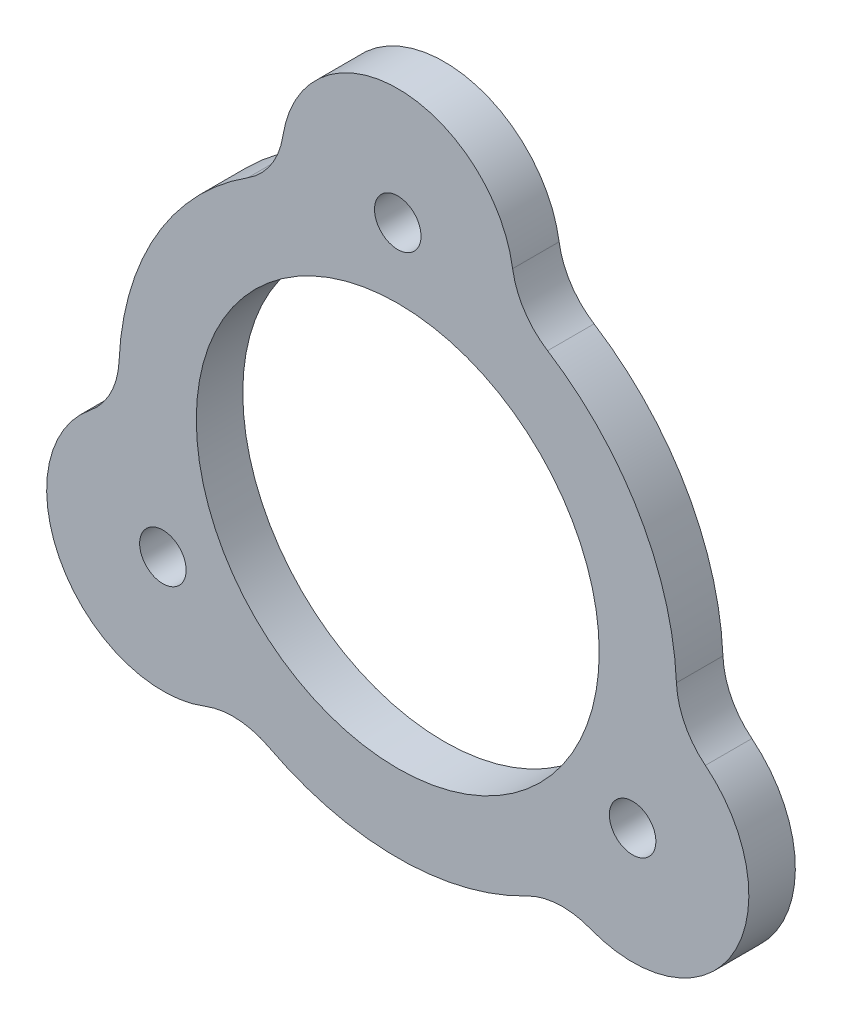
ISO-10303-21;
HEADER;
FILE_DESCRIPTION(('STEP AP214'),'2;1');
FILE_NAME('part.step','',(''),(''),'','','');
FILE_SCHEMA(('AUTOMOTIVE_DESIGN { 1 0 10303 214 1 1 1 1 }'));
ENDSEC;
DATA;
#1=APPLICATION_CONTEXT('core data for automotive mechanical design processes');
#2=APPLICATION_PROTOCOL_DEFINITION('international standard','automotive_design',2000,#1);
#3=PRODUCT_CONTEXT('',#1,'mechanical');
#4=PRODUCT('Part','Part','',(#3));
#5=PRODUCT_RELATED_PRODUCT_CATEGORY('part','',(#4));
#6=PRODUCT_DEFINITION_FORMATION('','',#4);
#7=PRODUCT_DEFINITION_CONTEXT('part definition',#1,'design');
#8=PRODUCT_DEFINITION('design','',#6,#7);
#9=PRODUCT_DEFINITION_SHAPE('','',#8);
#10=(LENGTH_UNIT() NAMED_UNIT(*) SI_UNIT(.MILLI.,.METRE.));
#11=(NAMED_UNIT(*) PLANE_ANGLE_UNIT() SI_UNIT($,.RADIAN.));
#12=(NAMED_UNIT(*) SI_UNIT($,.STERADIAN.) SOLID_ANGLE_UNIT());
#13=UNCERTAINTY_MEASURE_WITH_UNIT(LENGTH_MEASURE(1.E-05),#10,'distance_accuracy_value','');
#14=(GEOMETRIC_REPRESENTATION_CONTEXT(3) GLOBAL_UNCERTAINTY_ASSIGNED_CONTEXT((#13)) GLOBAL_UNIT_ASSIGNED_CONTEXT((#10,
#11,#12)) REPRESENTATION_CONTEXT('',''));
#15=CARTESIAN_POINT('',(0.,0.,0.));
#16=DIRECTION('',(0.,0.,1.));
#17=DIRECTION('',(1.,0.,0.));
#18=AXIS2_PLACEMENT_3D('',#15,#16,#17);
#19=CARTESIAN_POINT('',(0.,17.5,3.));
#20=DIRECTION('',(0.,0.,-1.));
#21=DIRECTION('',(-1.,0.,0.));
#22=AXIS2_PLACEMENT_3D('',#19,#20,#21);
#23=CYLINDRICAL_SURFACE('',#22,7.5);
#24=CARTESIAN_POINT('',(0.,17.5,3.));
#25=DIRECTION('',(0.,0.,1.));
#26=DIRECTION('',(1.,0.,0.));
#27=AXIS2_PLACEMENT_3D('',#24,#25,#26);
#28=CIRCLE('',#27,7.5);
#29=CARTESIAN_POINT('',(7.41285370151064,18.64,3.));
#30=VERTEX_POINT('',#29);
#31=CARTESIAN_POINT('',(-7.41285370151064,18.64,3.));
#32=VERTEX_POINT('',#31);
#33=EDGE_CURVE('E206',#30,#32,#28,.T.);
#34=ORIENTED_EDGE('',*,*,#33,.F.);
#35=DIRECTION('',(0.,0.,-1.));
#36=VECTOR('',#35,1.);
#37=CARTESIAN_POINT('',(7.41285370151064,18.64,3.));
#38=LINE('',#37,#36);
#39=CARTESIAN_POINT('',(7.41285370151064,18.64,0.));
#40=VERTEX_POINT('',#39);
#41=EDGE_CURVE('E169',#30,#40,#38,.T.);
#42=ORIENTED_EDGE('',*,*,#41,.T.);
#43=CARTESIAN_POINT('',(0.,17.5,0.));
#44=DIRECTION('',(0.,0.,1.));
#45=DIRECTION('',(1.,0.,0.));
#46=AXIS2_PLACEMENT_3D('',#43,#44,#45);
#47=CIRCLE('',#46,7.5);
#48=CARTESIAN_POINT('',(-7.41285370151064,18.64,0.));
#49=VERTEX_POINT('',#48);
#50=EDGE_CURVE('E130',#40,#49,#47,.T.);
#51=ORIENTED_EDGE('',*,*,#50,.T.);
#52=DIRECTION('',(0.,0.,-1.));
#53=VECTOR('',#52,1.);
#54=CARTESIAN_POINT('',(-7.41285370151064,18.64,3.));
#55=LINE('',#54,#53);
#56=EDGE_CURVE('E166',#49,#32,#55,.F.);
#57=ORIENTED_EDGE('',*,*,#56,.T.);
#58=EDGE_LOOP('',(#34,#42,#51,#57));
#59=FACE_BOUND('',#58,.T.);
#60=ADVANCED_FACE('F36',(#59),#23,.T.);
#61=CARTESIAN_POINT('',(-15.1554445662276,-8.75000000000007,3.));
#62=DIRECTION('',(0.,0.,-1.));
#63=DIRECTION('',(-1.,0.,0.));
#64=AXIS2_PLACEMENT_3D('',#61,#62,#63);
#65=CYLINDRICAL_SURFACE('',#64,7.5);
#66=CARTESIAN_POINT('',(-15.1554445662276,-8.75000000000007,3.));
#67=DIRECTION('',(0.,0.,1.));
#68=DIRECTION('',(1.,0.,0.));
#69=AXIS2_PLACEMENT_3D('',#66,#67,#68);
#70=CIRCLE('',#69,7.5);
#71=CARTESIAN_POINT('',(-19.8491403772972,-2.90028037995438,3.));
#72=VERTEX_POINT('',#71);
#73=CARTESIAN_POINT('',(-12.4362866757865,-15.7397196200458,3.));
#74=VERTEX_POINT('',#73);
#75=EDGE_CURVE('E156',#72,#74,#70,.T.);
#76=ORIENTED_EDGE('',*,*,#75,.F.);
#77=DIRECTION('',(0.,0.,-1.));
#78=VECTOR('',#77,1.);
#79=CARTESIAN_POINT('',(-19.8491403772972,-2.90028037995438,3.));
#80=LINE('',#79,#78);
#81=CARTESIAN_POINT('',(-19.8491403772972,-2.90028037995438,0.));
#82=VERTEX_POINT('',#81);
#83=EDGE_CURVE('E174',#72,#82,#80,.T.);
#84=ORIENTED_EDGE('',*,*,#83,.T.);
#85=CARTESIAN_POINT('',(-15.1554445662276,-8.75000000000007,0.));
#86=DIRECTION('',(0.,0.,1.));
#87=DIRECTION('',(1.,0.,0.));
#88=AXIS2_PLACEMENT_3D('',#85,#86,#87);
#89=CIRCLE('',#88,7.5);
#90=CARTESIAN_POINT('',(-12.4362866757865,-15.7397196200458,0.));
#91=VERTEX_POINT('',#90);
#92=EDGE_CURVE('E220',#82,#91,#89,.T.);
#93=ORIENTED_EDGE('',*,*,#92,.T.);
#94=DIRECTION('',(0.,0.,-1.));
#95=VECTOR('',#94,1.);
#96=CARTESIAN_POINT('',(-12.4362866757865,-15.7397196200458,3.));
#97=LINE('',#96,#95);
#98=EDGE_CURVE('E171',#91,#74,#97,.F.);
#99=ORIENTED_EDGE('',*,*,#98,.T.);
#100=EDGE_LOOP('',(#76,#84,#93,#99));
#101=FACE_BOUND('',#100,.T.);
#102=ADVANCED_FACE('F272',(#101),#65,.T.);
#103=CARTESIAN_POINT('',(15.1554445662276,-8.75000000000007,3.));
#104=DIRECTION('',(0.,0.,-1.));
#105=DIRECTION('',(-1.,0.,0.));
#106=AXIS2_PLACEMENT_3D('',#103,#104,#105);
#107=CYLINDRICAL_SURFACE('',#106,7.5);
#108=CARTESIAN_POINT('',(15.1554445662276,-8.75000000000007,0.));
#109=DIRECTION('',(0.,0.,1.));
#110=DIRECTION('',(1.,0.,0.));
#111=AXIS2_PLACEMENT_3D('',#108,#109,#110);
#112=CIRCLE('',#111,7.5);
#113=CARTESIAN_POINT('',(12.4362866757865,-15.7397196200458,0.));
#114=VERTEX_POINT('',#113);
#115=CARTESIAN_POINT('',(19.8491403772972,-2.90028037995437,0.));
#116=VERTEX_POINT('',#115);
#117=EDGE_CURVE('E159',#114,#116,#112,.T.);
#118=ORIENTED_EDGE('',*,*,#117,.T.);
#119=DIRECTION('',(0.,0.,-1.));
#120=VECTOR('',#119,1.);
#121=CARTESIAN_POINT('',(19.8491403772972,-2.90028037995437,3.));
#122=LINE('',#121,#120);
#123=CARTESIAN_POINT('',(19.8491403772972,-2.90028037995437,3.));
#124=VERTEX_POINT('',#123);
#125=EDGE_CURVE('E164',#116,#124,#122,.F.);
#126=ORIENTED_EDGE('',*,*,#125,.T.);
#127=CARTESIAN_POINT('',(15.1554445662276,-8.75000000000007,3.));
#128=DIRECTION('',(0.,0.,1.));
#129=DIRECTION('',(1.,0.,0.));
#130=AXIS2_PLACEMENT_3D('',#127,#128,#129);
#131=CIRCLE('',#130,7.5);
#132=CARTESIAN_POINT('',(12.4362866757865,-15.7397196200458,3.));
#133=VERTEX_POINT('',#132);
#134=EDGE_CURVE('E151',#133,#124,#131,.T.);
#135=ORIENTED_EDGE('',*,*,#134,.F.);
#136=DIRECTION('',(0.,0.,-1.));
#137=VECTOR('',#136,1.);
#138=CARTESIAN_POINT('',(12.4362866757865,-15.7397196200458,3.));
#139=LINE('',#138,#137);
#140=EDGE_CURVE('E153',#133,#114,#139,.T.);
#141=ORIENTED_EDGE('',*,*,#140,.T.);
#142=EDGE_LOOP('',(#118,#126,#135,#141));
#143=FACE_BOUND('',#142,.T.);
#144=ADVANCED_FACE('F258',(#143),#107,.T.);
#145=CARTESIAN_POINT('',(0.,0.,3.));
#146=DIRECTION('',(0.,0.,1.));
#147=DIRECTION('',(1.,0.,0.));
#148=AXIS2_PLACEMENT_3D('',#145,#146,#147);
#149=PLANE('',#148);
#150=CARTESIAN_POINT('',(15.1554445662275,-8.75000000000029,3.));
#151=DIRECTION('',(0.,0.,1.));
#152=DIRECTION('',(-0.500000000000016,-0.866025403784429,0.));
#153=AXIS2_PLACEMENT_3D('',#150,#151,#152);
#154=CIRCLE('',#153,1.5);
#155=CARTESIAN_POINT('',(14.4054445662275,-10.0490381056769,3.));
#156=VERTEX_POINT('',#155);
#157=EDGE_CURVE('E233',#156,#156,#154,.T.);
#158=ORIENTED_EDGE('',*,*,#157,.F.);
#159=EDGE_LOOP('',(#158));
#160=FACE_BOUND('',#159,.T.);
#161=CARTESIAN_POINT('',(-15.155444566228,-8.74999999999943,3.));
#162=DIRECTION('',(0.,0.,1.));
#163=DIRECTION('',(-0.499999999999967,0.866025403784457,0.));
#164=AXIS2_PLACEMENT_3D('',#161,#162,#163);
#165=CIRCLE('',#164,1.5);
#166=CARTESIAN_POINT('',(-15.905444566228,-7.45096189432274,3.));
#167=VERTEX_POINT('',#166);
#168=EDGE_CURVE('E239',#167,#167,#165,.T.);
#169=ORIENTED_EDGE('',*,*,#168,.F.);
#170=EDGE_LOOP('',(#169));
#171=FACE_BOUND('',#170,.T.);
#172=CARTESIAN_POINT('',(0.,17.5,3.));
#173=DIRECTION('',(0.,0.,1.));
#174=DIRECTION('',(1.,0.,0.));
#175=AXIS2_PLACEMENT_3D('',#172,#173,#174);
#176=CIRCLE('',#175,1.5);
#177=CARTESIAN_POINT('',(1.5,17.5,3.));
#178=VERTEX_POINT('',#177);
#179=EDGE_CURVE('E225',#178,#178,#176,.T.);
#180=ORIENTED_EDGE('',*,*,#179,.F.);
#181=EDGE_LOOP('',(#180));
#182=FACE_BOUND('',#181,.T.);
#183=CARTESIAN_POINT('',(0.,0.,3.));
#184=DIRECTION('',(0.,0.,1.));
#185=DIRECTION('',(1.,0.,0.));
#186=AXIS2_PLACEMENT_3D('',#183,#184,#185);
#187=CIRCLE('',#186,13.);
#188=CARTESIAN_POINT('',(13.,0.,3.));
#189=VERTEX_POINT('',#188);
#190=EDGE_CURVE('E245',#189,#189,#187,.T.);
#191=ORIENTED_EDGE('',*,*,#190,.F.);
#192=EDGE_LOOP('',(#191));
#193=FACE_BOUND('',#192,.T.);
#194=ORIENTED_EDGE('',*,*,#75,.T.);
#195=CARTESIAN_POINT('',(-10.6235147488258,-20.3995327000763,3.));
#196=DIRECTION('',(0.,0.,1.));
#197=DIRECTION('',(1.,0.,0.));
#198=AXIS2_PLACEMENT_3D('',#195,#196,#197);
#199=CIRCLE('',#198,5.);
#200=CARTESIAN_POINT('',(-8.3140550208202,-15.9648516783205,3.));
#201=VERTEX_POINT('',#200);
#202=EDGE_CURVE('E192',#74,#201,#199,.F.);
#203=ORIENTED_EDGE('',*,*,#202,.T.);
#204=CARTESIAN_POINT('',(0.,0.,3.));
#205=DIRECTION('',(0.,0.,1.));
#206=DIRECTION('',(1.,0.,0.));
#207=AXIS2_PLACEMENT_3D('',#204,#205,#206);
#208=CIRCLE('',#207,18.);
#209=CARTESIAN_POINT('',(8.3140550208202,-15.9648516783205,3.));
#210=VERTEX_POINT('',#209);
#211=EDGE_CURVE('E215',#201,#210,#208,.T.);
#212=ORIENTED_EDGE('',*,*,#211,.T.);
#213=CARTESIAN_POINT('',(10.6235147488258,-20.3995327000763,3.));
#214=DIRECTION('',(0.,0.,1.));
#215=DIRECTION('',(1.,0.,0.));
#216=AXIS2_PLACEMENT_3D('',#213,#214,#215);
#217=CIRCLE('',#216,5.);
#218=EDGE_CURVE('E197',#210,#133,#217,.F.);
#219=ORIENTED_EDGE('',*,*,#218,.T.);
#220=ORIENTED_EDGE('',*,*,#134,.T.);
#221=CARTESIAN_POINT('',(22.9782709180103,0.999532700076094,3.));
#222=DIRECTION('',(0.,0.,1.));
#223=DIRECTION('',(1.,0.,0.));
#224=AXIS2_PLACEMENT_3D('',#221,#222,#223);
#225=CIRCLE('',#224,5.);
#226=CARTESIAN_POINT('',(17.9829946314863,0.782242982668247,3.));
#227=VERTEX_POINT('',#226);
#228=EDGE_CURVE('E186',#124,#227,#225,.F.);
#229=ORIENTED_EDGE('',*,*,#228,.T.);
#230=CARTESIAN_POINT('',(9.66893961066605,15.1826086956522,3.));
#231=VERTEX_POINT('',#230);
#232=EDGE_CURVE('E217',#227,#231,#208,.T.);
#233=ORIENTED_EDGE('',*,*,#232,.T.);
#234=CARTESIAN_POINT('',(12.3547561691844,19.4,3.));
#235=DIRECTION('',(0.,0.,1.));
#236=DIRECTION('',(1.,0.,0.));
#237=AXIS2_PLACEMENT_3D('',#234,#235,#236);
#238=CIRCLE('',#237,5.);
#239=EDGE_CURVE('E135',#231,#30,#238,.F.);
#240=ORIENTED_EDGE('',*,*,#239,.T.);
#241=ORIENTED_EDGE('',*,*,#33,.T.);
#242=CARTESIAN_POINT('',(-12.3547561691844,19.4,3.));
#243=DIRECTION('',(0.,0.,1.));
#244=DIRECTION('',(1.,0.,0.));
#245=AXIS2_PLACEMENT_3D('',#242,#243,#244);
#246=CIRCLE('',#245,5.);
#247=CARTESIAN_POINT('',(-9.66893961066605,15.1826086956522,3.));
#248=VERTEX_POINT('',#247);
#249=EDGE_CURVE('E44',#32,#248,#246,.F.);
#250=ORIENTED_EDGE('',*,*,#249,.T.);
#251=CARTESIAN_POINT('',(-17.9829946314863,0.782242982668247,3.));
#252=VERTEX_POINT('',#251);
#253=EDGE_CURVE('E147',#248,#252,#208,.T.);
#254=ORIENTED_EDGE('',*,*,#253,.T.);
#255=CARTESIAN_POINT('',(-22.9782709180103,0.999532700076094,3.));
#256=DIRECTION('',(0.,0.,1.));
#257=DIRECTION('',(1.,0.,0.));
#258=AXIS2_PLACEMENT_3D('',#255,#256,#257);
#259=CIRCLE('',#258,5.);
#260=EDGE_CURVE('E190',#252,#72,#259,.F.);
#261=ORIENTED_EDGE('',*,*,#260,.T.);
#262=EDGE_LOOP('',(#194,#203,#212,#219,#220,#229,#233,#240,#241,#250,#254,#261));
#263=FACE_BOUND('',#262,.T.);
#264=ADVANCED_FACE('F203',(#160,#171,#182,#193,#263),#149,.T.);
#265=CARTESIAN_POINT('',(0.,0.,0.));
#266=DIRECTION('',(0.,0.,1.));
#267=DIRECTION('',(1.,0.,0.));
#268=AXIS2_PLACEMENT_3D('',#265,#266,#267);
#269=PLANE('',#268);
#270=CARTESIAN_POINT('',(0.,0.,0.));
#271=DIRECTION('',(0.,0.,1.));
#272=DIRECTION('',(1.,0.,0.));
#273=AXIS2_PLACEMENT_3D('',#270,#271,#272);
#274=CIRCLE('',#273,13.);
#275=CARTESIAN_POINT('',(13.,0.,0.));
#276=VERTEX_POINT('',#275);
#277=EDGE_CURVE('E248',#276,#276,#274,.T.);
#278=ORIENTED_EDGE('',*,*,#277,.T.);
#279=EDGE_LOOP('',(#278));
#280=FACE_BOUND('',#279,.T.);
#281=CARTESIAN_POINT('',(0.,17.5,0.));
#282=DIRECTION('',(0.,0.,1.));
#283=DIRECTION('',(1.,0.,0.));
#284=AXIS2_PLACEMENT_3D('',#281,#282,#283);
#285=CIRCLE('',#284,1.5);
#286=CARTESIAN_POINT('',(1.5,17.5,0.));
#287=VERTEX_POINT('',#286);
#288=EDGE_CURVE('E221',#287,#287,#285,.T.);
#289=ORIENTED_EDGE('',*,*,#288,.T.);
#290=EDGE_LOOP('',(#289));
#291=FACE_BOUND('',#290,.T.);
#292=CARTESIAN_POINT('',(-15.155444566228,-8.74999999999943,0.));
#293=DIRECTION('',(0.,0.,1.));
#294=DIRECTION('',(-0.499999999999967,0.866025403784457,0.));
#295=AXIS2_PLACEMENT_3D('',#292,#293,#294);
#296=CIRCLE('',#295,1.5);
#297=CARTESIAN_POINT('',(-15.905444566228,-7.45096189432274,0.));
#298=VERTEX_POINT('',#297);
#299=EDGE_CURVE('E236',#298,#298,#296,.T.);
#300=ORIENTED_EDGE('',*,*,#299,.T.);
#301=EDGE_LOOP('',(#300));
#302=FACE_BOUND('',#301,.T.);
#303=CARTESIAN_POINT('',(15.1554445662275,-8.75000000000029,0.));
#304=DIRECTION('',(0.,0.,1.));
#305=DIRECTION('',(-0.500000000000016,-0.866025403784429,0.));
#306=AXIS2_PLACEMENT_3D('',#303,#304,#305);
#307=CIRCLE('',#306,1.5);
#308=CARTESIAN_POINT('',(14.4054445662275,-10.0490381056769,0.));
#309=VERTEX_POINT('',#308);
#310=EDGE_CURVE('E231',#309,#309,#307,.T.);
#311=ORIENTED_EDGE('',*,*,#310,.T.);
#312=EDGE_LOOP('',(#311));
#313=FACE_BOUND('',#312,.T.);
#314=ORIENTED_EDGE('',*,*,#117,.F.);
#315=CARTESIAN_POINT('',(10.6235147488258,-20.3995327000763,0.));
#316=DIRECTION('',(0.,0.,1.));
#317=DIRECTION('',(1.,0.,0.));
#318=AXIS2_PLACEMENT_3D('',#315,#316,#317);
#319=CIRCLE('',#318,5.);
#320=CARTESIAN_POINT('',(8.3140550208202,-15.9648516783205,0.));
#321=VERTEX_POINT('',#320);
#322=EDGE_CURVE('E58',#114,#321,#319,.T.);
#323=ORIENTED_EDGE('',*,*,#322,.T.);
#324=CARTESIAN_POINT('',(0.,0.,0.));
#325=DIRECTION('',(0.,0.,1.));
#326=DIRECTION('',(1.,0.,0.));
#327=AXIS2_PLACEMENT_3D('',#324,#325,#326);
#328=CIRCLE('',#327,18.);
#329=CARTESIAN_POINT('',(-8.3140550208202,-15.9648516783205,0.));
#330=VERTEX_POINT('',#329);
#331=EDGE_CURVE('E149',#321,#330,#328,.F.);
#332=ORIENTED_EDGE('',*,*,#331,.T.);
#333=CARTESIAN_POINT('',(-10.6235147488258,-20.3995327000763,0.));
#334=DIRECTION('',(0.,0.,1.));
#335=DIRECTION('',(1.,0.,0.));
#336=AXIS2_PLACEMENT_3D('',#333,#334,#335);
#337=CIRCLE('',#336,5.);
#338=EDGE_CURVE('E194',#330,#91,#337,.T.);
#339=ORIENTED_EDGE('',*,*,#338,.T.);
#340=ORIENTED_EDGE('',*,*,#92,.F.);
#341=CARTESIAN_POINT('',(-22.9782709180103,0.999532700076094,0.));
#342=DIRECTION('',(0.,0.,1.));
#343=DIRECTION('',(1.,0.,0.));
#344=AXIS2_PLACEMENT_3D('',#341,#342,#343);
#345=CIRCLE('',#344,5.);
#346=CARTESIAN_POINT('',(-17.9829946314863,0.782242982668247,0.));
#347=VERTEX_POINT('',#346);
#348=EDGE_CURVE('E134',#82,#347,#345,.T.);
#349=ORIENTED_EDGE('',*,*,#348,.T.);
#350=CARTESIAN_POINT('',(-9.66893961066605,15.1826086956522,0.));
#351=VERTEX_POINT('',#350);
#352=EDGE_CURVE('E146',#347,#351,#328,.F.);
#353=ORIENTED_EDGE('',*,*,#352,.T.);
#354=CARTESIAN_POINT('',(-12.3547561691844,19.4,0.));
#355=DIRECTION('',(0.,0.,1.));
#356=DIRECTION('',(1.,0.,0.));
#357=AXIS2_PLACEMENT_3D('',#354,#355,#356);
#358=CIRCLE('',#357,5.);
#359=EDGE_CURVE('E11',#351,#49,#358,.T.);
#360=ORIENTED_EDGE('',*,*,#359,.T.);
#361=ORIENTED_EDGE('',*,*,#50,.F.);
#362=CARTESIAN_POINT('',(12.3547561691844,19.4,0.));
#363=DIRECTION('',(0.,0.,1.));
#364=DIRECTION('',(1.,0.,0.));
#365=AXIS2_PLACEMENT_3D('',#362,#363,#364);
#366=CIRCLE('',#365,5.);
#367=CARTESIAN_POINT('',(9.66893961066605,15.1826086956522,0.));
#368=VERTEX_POINT('',#367);
#369=EDGE_CURVE('E125',#40,#368,#366,.T.);
#370=ORIENTED_EDGE('',*,*,#369,.T.);
#371=CARTESIAN_POINT('',(17.9829946314863,0.782242982668247,0.));
#372=VERTEX_POINT('',#371);
#373=EDGE_CURVE('E128',#368,#372,#328,.F.);
#374=ORIENTED_EDGE('',*,*,#373,.T.);
#375=CARTESIAN_POINT('',(22.9782709180103,0.999532700076094,0.));
#376=DIRECTION('',(0.,0.,1.));
#377=DIRECTION('',(1.,0.,0.));
#378=AXIS2_PLACEMENT_3D('',#375,#376,#377);
#379=CIRCLE('',#378,5.);
#380=EDGE_CURVE('E184',#372,#116,#379,.T.);
#381=ORIENTED_EDGE('',*,*,#380,.T.);
#382=EDGE_LOOP('',(#314,#323,#332,#339,#340,#349,#353,#360,#361,#370,#374,#381));
#383=FACE_BOUND('',#382,.T.);
#384=ADVANCED_FACE('F127',(#280,#291,#302,#313,#383),#269,.F.);
#385=CARTESIAN_POINT('',(0.,17.5,0.));
#386=DIRECTION('',(0.,0.,1.));
#387=DIRECTION('',(1.,0.,0.));
#388=AXIS2_PLACEMENT_3D('',#385,#386,#387);
#389=CYLINDRICAL_SURFACE('',#388,1.5);
#390=ORIENTED_EDGE('',*,*,#288,.F.);
#391=EDGE_LOOP('',(#390));
#392=FACE_BOUND('',#391,.T.);
#393=ORIENTED_EDGE('',*,*,#179,.T.);
#394=EDGE_LOOP('',(#393));
#395=FACE_BOUND('',#394,.T.);
#396=ADVANCED_FACE('F313',(#392,#395),#389,.F.);
#397=CARTESIAN_POINT('',(15.1554445662275,-8.75000000000029,0.));
#398=DIRECTION('',(0.,0.,1.));
#399=DIRECTION('',(1.,0.,0.));
#400=AXIS2_PLACEMENT_3D('',#397,#398,#399);
#401=CYLINDRICAL_SURFACE('',#400,1.5);
#402=ORIENTED_EDGE('',*,*,#310,.F.);
#403=EDGE_LOOP('',(#402));
#404=FACE_BOUND('',#403,.T.);
#405=ORIENTED_EDGE('',*,*,#157,.T.);
#406=EDGE_LOOP('',(#405));
#407=FACE_BOUND('',#406,.T.);
#408=ADVANCED_FACE('F308',(#404,#407),#401,.F.);
#409=CARTESIAN_POINT('',(-15.155444566228,-8.74999999999943,0.));
#410=DIRECTION('',(0.,0.,1.));
#411=DIRECTION('',(1.,0.,0.));
#412=AXIS2_PLACEMENT_3D('',#409,#410,#411);
#413=CYLINDRICAL_SURFACE('',#412,1.5);
#414=ORIENTED_EDGE('',*,*,#299,.F.);
#415=EDGE_LOOP('',(#414));
#416=FACE_BOUND('',#415,.T.);
#417=ORIENTED_EDGE('',*,*,#168,.T.);
#418=EDGE_LOOP('',(#417));
#419=FACE_BOUND('',#418,.T.);
#420=ADVANCED_FACE('F304',(#416,#419),#413,.F.);
#421=CARTESIAN_POINT('',(0.,0.,-50.9116882454314));
#422=DIRECTION('',(0.,0.,1.));
#423=DIRECTION('',(1.,0.,0.));
#424=AXIS2_PLACEMENT_3D('',#421,#422,#423);
#425=CYLINDRICAL_SURFACE('',#424,18.);
#426=ORIENTED_EDGE('',*,*,#211,.F.);
#427=DIRECTION('',(0.,0.,1.));
#428=VECTOR('',#427,1.);
#429=CARTESIAN_POINT('',(-8.3140550208202,-15.9648516783205,-50.9116882454314));
#430=LINE('',#429,#428);
#431=EDGE_CURVE('E51',#201,#330,#430,.F.);
#432=ORIENTED_EDGE('',*,*,#431,.T.);
#433=ORIENTED_EDGE('',*,*,#331,.F.);
#434=DIRECTION('',(0.,0.,1.));
#435=VECTOR('',#434,1.);
#436=CARTESIAN_POINT('',(8.3140550208202,-15.9648516783205,-50.9116882454314));
#437=LINE('',#436,#435);
#438=EDGE_CURVE('E181',#321,#210,#437,.T.);
#439=ORIENTED_EDGE('',*,*,#438,.T.);
#440=EDGE_LOOP('',(#426,#432,#433,#439));
#441=FACE_BOUND('',#440,.T.);
#442=ADVANCED_FACE('F265',(#441),#425,.T.);
#443=ORIENTED_EDGE('',*,*,#352,.F.);
#444=DIRECTION('',(0.,0.,1.));
#445=VECTOR('',#444,1.);
#446=CARTESIAN_POINT('',(-17.9829946314863,0.782242982668247,-50.9116882454314));
#447=LINE('',#446,#445);
#448=EDGE_CURVE('E179',#347,#252,#447,.T.);
#449=ORIENTED_EDGE('',*,*,#448,.T.);
#450=ORIENTED_EDGE('',*,*,#253,.F.);
#451=DIRECTION('',(0.,0.,1.));
#452=VECTOR('',#451,1.);
#453=CARTESIAN_POINT('',(-9.66893961066605,15.1826086956522,-50.9116882454314));
#454=LINE('',#453,#452);
#455=EDGE_CURVE('E177',#248,#351,#454,.F.);
#456=ORIENTED_EDGE('',*,*,#455,.T.);
#457=EDGE_LOOP('',(#443,#449,#450,#456));
#458=FACE_BOUND('',#457,.T.);
#459=ADVANCED_FACE('F212',(#458),#425,.T.);
#460=ORIENTED_EDGE('',*,*,#232,.F.);
#461=DIRECTION('',(0.,0.,1.));
#462=VECTOR('',#461,1.);
#463=CARTESIAN_POINT('',(17.9829946314863,0.782242982668247,-50.9116882454314));
#464=LINE('',#463,#462);
#465=EDGE_CURVE('E145',#227,#372,#464,.F.);
#466=ORIENTED_EDGE('',*,*,#465,.T.);
#467=ORIENTED_EDGE('',*,*,#373,.F.);
#468=DIRECTION('',(0.,0.,1.));
#469=VECTOR('',#468,1.);
#470=CARTESIAN_POINT('',(9.66893961066605,15.1826086956522,-50.9116882454314));
#471=LINE('',#470,#469);
#472=EDGE_CURVE('E142',#368,#231,#471,.T.);
#473=ORIENTED_EDGE('',*,*,#472,.T.);
#474=EDGE_LOOP('',(#460,#466,#467,#473));
#475=FACE_BOUND('',#474,.T.);
#476=ADVANCED_FACE('F141',(#475),#425,.T.);
#477=CARTESIAN_POINT('',(22.9782709180103,0.999532700076094,3.));
#478=DIRECTION('',(0.,0.,1.));
#479=DIRECTION('',(1.,0.,0.));
#480=AXIS2_PLACEMENT_3D('',#477,#478,#479);
#481=CYLINDRICAL_SURFACE('',#480,5.);
#482=ORIENTED_EDGE('',*,*,#228,.F.);
#483=ORIENTED_EDGE('',*,*,#125,.F.);
#484=ORIENTED_EDGE('',*,*,#380,.F.);
#485=ORIENTED_EDGE('',*,*,#465,.F.);
#486=EDGE_LOOP('',(#482,#483,#484,#485));
#487=FACE_BOUND('',#486,.T.);
#488=ADVANCED_FACE('F254',(#487),#481,.F.);
#489=CARTESIAN_POINT('',(12.3547561691844,19.4,3.));
#490=DIRECTION('',(0.,0.,-1.));
#491=DIRECTION('',(-1.,0.,0.));
#492=AXIS2_PLACEMENT_3D('',#489,#490,#491);
#493=CYLINDRICAL_SURFACE('',#492,5.);
#494=ORIENTED_EDGE('',*,*,#369,.F.);
#495=ORIENTED_EDGE('',*,*,#41,.F.);
#496=ORIENTED_EDGE('',*,*,#239,.F.);
#497=ORIENTED_EDGE('',*,*,#472,.F.);
#498=EDGE_LOOP('',(#494,#495,#496,#497));
#499=FACE_BOUND('',#498,.T.);
#500=ADVANCED_FACE('F150',(#499),#493,.F.);
#501=CARTESIAN_POINT('',(-22.9782709180103,0.999532700076094,-50.9116882454314));
#502=DIRECTION('',(0.,0.,1.));
#503=DIRECTION('',(1.,0.,0.));
#504=AXIS2_PLACEMENT_3D('',#501,#502,#503);
#505=CYLINDRICAL_SURFACE('',#504,5.);
#506=ORIENTED_EDGE('',*,*,#260,.F.);
#507=ORIENTED_EDGE('',*,*,#448,.F.);
#508=ORIENTED_EDGE('',*,*,#348,.F.);
#509=ORIENTED_EDGE('',*,*,#83,.F.);
#510=EDGE_LOOP('',(#506,#507,#508,#509));
#511=FACE_BOUND('',#510,.T.);
#512=ADVANCED_FACE('F276',(#511),#505,.F.);
#513=CARTESIAN_POINT('',(-10.6235147488258,-20.3995327000763,-50.9116882454314));
#514=DIRECTION('',(0.,0.,-1.));
#515=DIRECTION('',(-1.,0.,0.));
#516=AXIS2_PLACEMENT_3D('',#513,#514,#515);
#517=CYLINDRICAL_SURFACE('',#516,5.);
#518=ORIENTED_EDGE('',*,*,#338,.F.);
#519=ORIENTED_EDGE('',*,*,#431,.F.);
#520=ORIENTED_EDGE('',*,*,#202,.F.);
#521=ORIENTED_EDGE('',*,*,#98,.F.);
#522=EDGE_LOOP('',(#518,#519,#520,#521));
#523=FACE_BOUND('',#522,.T.);
#524=ADVANCED_FACE('F270',(#523),#517,.F.);
#525=CARTESIAN_POINT('',(10.6235147488258,-20.3995327000763,-50.9116882454314));
#526=DIRECTION('',(0.,0.,1.));
#527=DIRECTION('',(1.,0.,0.));
#528=AXIS2_PLACEMENT_3D('',#525,#526,#527);
#529=CYLINDRICAL_SURFACE('',#528,5.);
#530=ORIENTED_EDGE('',*,*,#218,.F.);
#531=ORIENTED_EDGE('',*,*,#438,.F.);
#532=ORIENTED_EDGE('',*,*,#322,.F.);
#533=ORIENTED_EDGE('',*,*,#140,.F.);
#534=EDGE_LOOP('',(#530,#531,#532,#533));
#535=FACE_BOUND('',#534,.T.);
#536=ADVANCED_FACE('F263',(#535),#529,.F.);
#537=CARTESIAN_POINT('',(-12.3547561691844,19.4,-50.9116882454314));
#538=DIRECTION('',(0.,0.,-1.));
#539=DIRECTION('',(-1.,0.,0.));
#540=AXIS2_PLACEMENT_3D('',#537,#538,#539);
#541=CYLINDRICAL_SURFACE('',#540,5.);
#542=ORIENTED_EDGE('',*,*,#359,.F.);
#543=ORIENTED_EDGE('',*,*,#455,.F.);
#544=ORIENTED_EDGE('',*,*,#249,.F.);
#545=ORIENTED_EDGE('',*,*,#56,.F.);
#546=EDGE_LOOP('',(#542,#543,#544,#545));
#547=FACE_BOUND('',#546,.T.);
#548=ADVANCED_FACE('F38',(#547),#541,.F.);
#549=CARTESIAN_POINT('',(0.,0.,0.));
#550=DIRECTION('',(0.,0.,1.));
#551=DIRECTION('',(1.,0.,0.));
#552=AXIS2_PLACEMENT_3D('',#549,#550,#551);
#553=CYLINDRICAL_SURFACE('',#552,13.);
#554=ORIENTED_EDGE('',*,*,#277,.F.);
#555=EDGE_LOOP('',(#554));
#556=FACE_BOUND('',#555,.T.);
#557=ORIENTED_EDGE('',*,*,#190,.T.);
#558=EDGE_LOOP('',(#557));
#559=FACE_BOUND('',#558,.T.);
#560=ADVANCED_FACE('F419',(#556,#559),#553,.F.);
#561=CLOSED_SHELL('',(#60,#102,#144,#264,#384,#396,#408,#420,#442,#459,#476,#488,#500,#512,#524,
#536,#548,#560));
#562=MANIFOLD_SOLID_BREP('B2',#561);
#563=ADVANCED_BREP_SHAPE_REPRESENTATION('',(#18,#562),#14);
#564=SHAPE_DEFINITION_REPRESENTATION(#9,#563);
ENDSEC;
END-ISO-10303-21;
